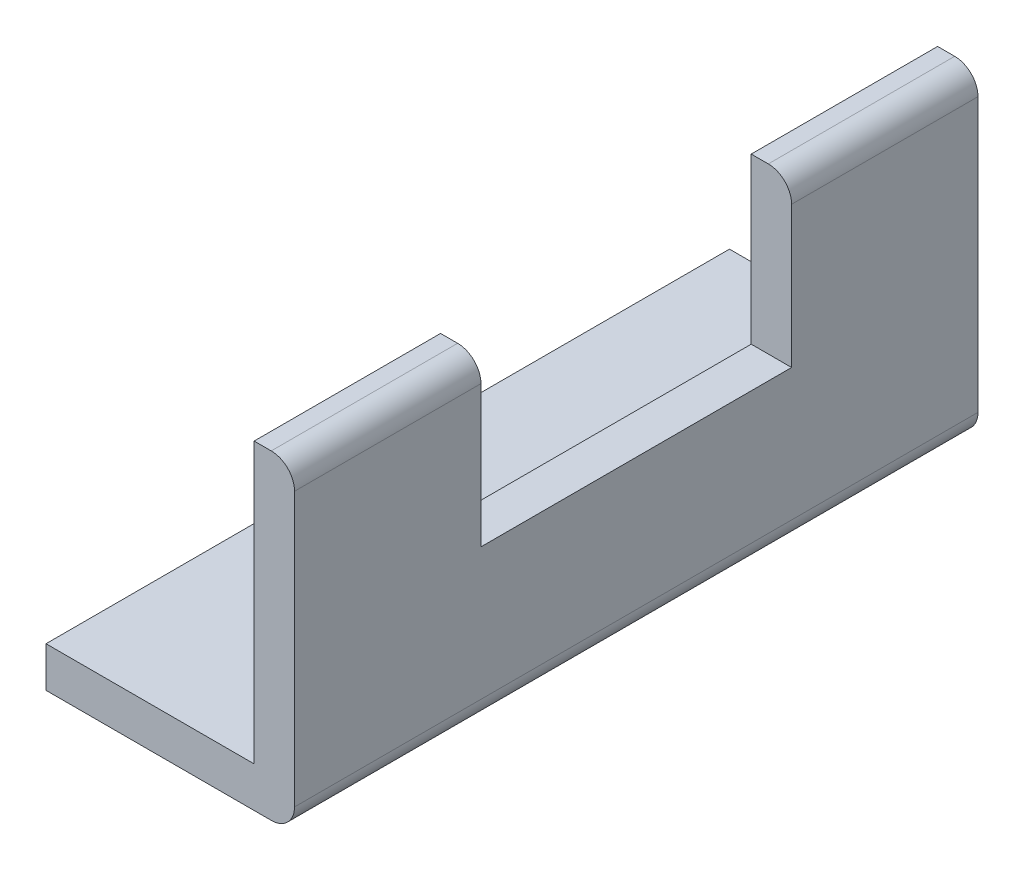
ISO-10303-21;
HEADER;
FILE_DESCRIPTION(('STEP AP214'),'2;1');
FILE_NAME('part.step','',(''),(''),'','','');
FILE_SCHEMA(('AUTOMOTIVE_DESIGN { 1 0 10303 214 1 1 1 1 }'));
ENDSEC;
DATA;
#1=APPLICATION_CONTEXT('core data for automotive mechanical design processes');
#2=APPLICATION_PROTOCOL_DEFINITION('international standard','automotive_design',2000,#1);
#3=PRODUCT_CONTEXT('',#1,'mechanical');
#4=PRODUCT('Part','Part','',(#3));
#5=PRODUCT_RELATED_PRODUCT_CATEGORY('part','',(#4));
#6=PRODUCT_DEFINITION_FORMATION('','',#4);
#7=PRODUCT_DEFINITION_CONTEXT('part definition',#1,'design');
#8=PRODUCT_DEFINITION('design','',#6,#7);
#9=PRODUCT_DEFINITION_SHAPE('','',#8);
#10=(LENGTH_UNIT() NAMED_UNIT(*) SI_UNIT(.MILLI.,.METRE.));
#11=(NAMED_UNIT(*) PLANE_ANGLE_UNIT() SI_UNIT($,.RADIAN.));
#12=(NAMED_UNIT(*) SI_UNIT($,.STERADIAN.) SOLID_ANGLE_UNIT());
#13=UNCERTAINTY_MEASURE_WITH_UNIT(LENGTH_MEASURE(1.E-05),#10,'distance_accuracy_value','');
#14=(GEOMETRIC_REPRESENTATION_CONTEXT(3) GLOBAL_UNCERTAINTY_ASSIGNED_CONTEXT((#13)) GLOBAL_UNIT_ASSIGNED_CONTEXT((#10,
#11,#12)) REPRESENTATION_CONTEXT('',''));
#15=CARTESIAN_POINT('',(0.,0.,0.));
#16=DIRECTION('',(0.,0.,1.));
#17=DIRECTION('',(1.,0.,0.));
#18=AXIS2_PLACEMENT_3D('',#15,#16,#17);
#19=CARTESIAN_POINT('',(0.,1.03,-1.6));
#20=DIRECTION('',(0.,0.,1.));
#21=DIRECTION('',(1.,0.,0.));
#22=AXIS2_PLACEMENT_3D('',#19,#20,#21);
#23=PLANE('',#22);
#24=DIRECTION('',(0.,1.,0.));
#25=VECTOR('',#24,1.);
#26=CARTESIAN_POINT('',(0.67,1.03,-1.6));
#27=LINE('',#26,#25);
#28=CARTESIAN_POINT('',(0.67,1.03,-1.6));
#29=VERTEX_POINT('',#28);
#30=CARTESIAN_POINT('',(0.67,0.5,-1.6));
#31=VERTEX_POINT('',#30);
#32=EDGE_CURVE('E145',#29,#31,#27,.F.);
#33=ORIENTED_EDGE('',*,*,#32,.T.);
#34=DIRECTION('',(1.,0.,0.));
#35=VECTOR('',#34,1.);
#36=CARTESIAN_POINT('',(0.,0.5,-1.6));
#37=LINE('',#36,#35);
#38=CARTESIAN_POINT('',(0.8,0.500000000000001,-1.6));
#39=VERTEX_POINT('',#38);
#40=EDGE_CURVE('E175',#31,#39,#37,.T.);
#41=ORIENTED_EDGE('',*,*,#40,.T.);
#42=DIRECTION('',(0.,1.,0.));
#43=VECTOR('',#42,1.);
#44=CARTESIAN_POINT('',(0.8,0.,-1.6));
#45=LINE('',#44,#43);
#46=CARTESIAN_POINT('',(0.8,0.955,-1.6));
#47=VERTEX_POINT('',#46);
#48=EDGE_CURVE('E125',#47,#39,#45,.F.);
#49=ORIENTED_EDGE('',*,*,#48,.F.);
#50=CARTESIAN_POINT('',(0.725,0.955,-1.6));
#51=DIRECTION('',(0.,0.,1.));
#52=DIRECTION('',(1.,0.,0.));
#53=AXIS2_PLACEMENT_3D('',#50,#51,#52);
#54=CIRCLE('',#53,0.075);
#55=CARTESIAN_POINT('',(0.725,1.03,-1.6));
#56=VERTEX_POINT('',#55);
#57=EDGE_CURVE('E20',#56,#47,#54,.F.);
#58=ORIENTED_EDGE('',*,*,#57,.F.);
#59=DIRECTION('',(-1.,0.,0.));
#60=VECTOR('',#59,1.);
#61=CARTESIAN_POINT('',(0.,1.03,-1.6));
#62=LINE('',#61,#60);
#63=EDGE_CURVE('E109',#29,#56,#62,.F.);
#64=ORIENTED_EDGE('',*,*,#63,.F.);
#65=EDGE_LOOP('',(#33,#41,#49,#58,#64));
#66=FACE_BOUND('',#65,.T.);
#67=ADVANCED_FACE('F17',(#66),#23,.T.);
#68=CARTESIAN_POINT('',(0.,0.5,-0.6));
#69=DIRECTION('',(0.,-1.,0.));
#70=DIRECTION('',(1.,0.,0.));
#71=AXIS2_PLACEMENT_3D('',#68,#69,#70);
#72=PLANE('',#71);
#73=DIRECTION('',(0.,0.,-1.));
#74=VECTOR('',#73,1.);
#75=CARTESIAN_POINT('',(0.8,0.5,-2.2));
#76=LINE('',#75,#74);
#77=CARTESIAN_POINT('',(0.8,0.5,-0.6));
#78=VERTEX_POINT('',#77);
#79=EDGE_CURVE('E161',#39,#78,#76,.F.);
#80=ORIENTED_EDGE('',*,*,#79,.F.);
#81=ORIENTED_EDGE('',*,*,#40,.F.);
#82=DIRECTION('',(0.,0.,1.));
#83=VECTOR('',#82,1.);
#84=CARTESIAN_POINT('',(0.67,0.5,-2.2));
#85=LINE('',#84,#83);
#86=CARTESIAN_POINT('',(0.67,0.5,-0.6));
#87=VERTEX_POINT('',#86);
#88=EDGE_CURVE('E165',#31,#87,#85,.T.);
#89=ORIENTED_EDGE('',*,*,#88,.T.);
#90=DIRECTION('',(1.,0.,0.));
#91=VECTOR('',#90,1.);
#92=CARTESIAN_POINT('',(0.,0.5,-0.6));
#93=LINE('',#92,#91);
#94=EDGE_CURVE('E150',#87,#78,#93,.T.);
#95=ORIENTED_EDGE('',*,*,#94,.T.);
#96=EDGE_LOOP('',(#80,#81,#89,#95));
#97=FACE_BOUND('',#96,.T.);
#98=ADVANCED_FACE('F295',(#97),#72,.F.);
#99=CARTESIAN_POINT('',(0.,1.03,-0.6));
#100=DIRECTION('',(0.,0.,1.));
#101=DIRECTION('',(0.,-1.,0.));
#102=AXIS2_PLACEMENT_3D('',#99,#100,#101);
#103=PLANE('',#102);
#104=CARTESIAN_POINT('',(0.725,0.955,-0.6));
#105=DIRECTION('',(0.,0.,1.));
#106=DIRECTION('',(1.,0.,0.));
#107=AXIS2_PLACEMENT_3D('',#104,#105,#106);
#108=CIRCLE('',#107,0.075);
#109=CARTESIAN_POINT('',(0.8,0.955,-0.6));
#110=VERTEX_POINT('',#109);
#111=CARTESIAN_POINT('',(0.725,1.03,-0.6));
#112=VERTEX_POINT('',#111);
#113=EDGE_CURVE('E203',#110,#112,#108,.T.);
#114=ORIENTED_EDGE('',*,*,#113,.F.);
#115=DIRECTION('',(0.,1.,0.));
#116=VECTOR('',#115,1.);
#117=CARTESIAN_POINT('',(0.8,0.,-0.6));
#118=LINE('',#117,#116);
#119=EDGE_CURVE('E128',#78,#110,#118,.T.);
#120=ORIENTED_EDGE('',*,*,#119,.F.);
#121=ORIENTED_EDGE('',*,*,#94,.F.);
#122=DIRECTION('',(0.,1.,0.));
#123=VECTOR('',#122,1.);
#124=CARTESIAN_POINT('',(0.67,1.03,-0.6));
#125=LINE('',#124,#123);
#126=CARTESIAN_POINT('',(0.67,1.03,-0.6));
#127=VERTEX_POINT('',#126);
#128=EDGE_CURVE('E120',#87,#127,#125,.T.);
#129=ORIENTED_EDGE('',*,*,#128,.T.);
#130=DIRECTION('',(-1.,0.,0.));
#131=VECTOR('',#130,1.);
#132=CARTESIAN_POINT('',(0.,1.03,-0.6));
#133=LINE('',#132,#131);
#134=EDGE_CURVE('E157',#112,#127,#133,.T.);
#135=ORIENTED_EDGE('',*,*,#134,.F.);
#136=EDGE_LOOP('',(#114,#120,#121,#129,#135));
#137=FACE_BOUND('',#136,.T.);
#138=ADVANCED_FACE('F298',(#137),#103,.F.);
#139=CARTESIAN_POINT('',(0.67,1.03,-2.2));
#140=DIRECTION('',(1.,0.,0.));
#141=DIRECTION('',(0.,1.,0.));
#142=AXIS2_PLACEMENT_3D('',#139,#140,#141);
#143=PLANE('',#142);
#144=ORIENTED_EDGE('',*,*,#128,.F.);
#145=ORIENTED_EDGE('',*,*,#88,.F.);
#146=ORIENTED_EDGE('',*,*,#32,.F.);
#147=DIRECTION('',(0.,0.,1.));
#148=VECTOR('',#147,1.);
#149=CARTESIAN_POINT('',(0.67,1.03,-2.2));
#150=LINE('',#149,#148);
#151=CARTESIAN_POINT('',(0.67,1.03,-2.2));
#152=VERTEX_POINT('',#151);
#153=EDGE_CURVE('E117',#152,#29,#150,.T.);
#154=ORIENTED_EDGE('',*,*,#153,.F.);
#155=DIRECTION('',(0.,1.,0.));
#156=VECTOR('',#155,1.);
#157=CARTESIAN_POINT('',(0.67,1.03,-2.2));
#158=LINE('',#157,#156);
#159=CARTESIAN_POINT('',(0.67,0.13,-2.2));
#160=VERTEX_POINT('',#159);
#161=EDGE_CURVE('E143',#160,#152,#158,.T.);
#162=ORIENTED_EDGE('',*,*,#161,.F.);
#163=DIRECTION('',(0.,0.,1.));
#164=VECTOR('',#163,1.);
#165=CARTESIAN_POINT('',(0.67,0.13,-2.2));
#166=LINE('',#165,#164);
#167=CARTESIAN_POINT('',(0.67,0.13,0.));
#168=VERTEX_POINT('',#167);
#169=EDGE_CURVE('E220',#160,#168,#166,.T.);
#170=ORIENTED_EDGE('',*,*,#169,.T.);
#171=DIRECTION('',(0.,1.,0.));
#172=VECTOR('',#171,1.);
#173=CARTESIAN_POINT('',(0.67,1.03,0.));
#174=LINE('',#173,#172);
#175=CARTESIAN_POINT('',(0.67,1.03,0.));
#176=VERTEX_POINT('',#175);
#177=EDGE_CURVE('E146',#176,#168,#174,.F.);
#178=ORIENTED_EDGE('',*,*,#177,.F.);
#179=DIRECTION('',(0.,0.,1.));
#180=VECTOR('',#179,1.);
#181=CARTESIAN_POINT('',(0.67,1.03,-2.2));
#182=LINE('',#181,#180);
#183=EDGE_CURVE('E160',#127,#176,#182,.T.);
#184=ORIENTED_EDGE('',*,*,#183,.F.);
#185=EDGE_LOOP('',(#144,#145,#146,#154,#162,#170,#178,#184));
#186=FACE_BOUND('',#185,.T.);
#187=ADVANCED_FACE('F288',(#186),#143,.F.);
#188=CARTESIAN_POINT('',(0.,1.03,-2.2));
#189=DIRECTION('',(0.,1.,0.));
#190=DIRECTION('',(-1.,0.,0.));
#191=AXIS2_PLACEMENT_3D('',#188,#189,#190);
#192=PLANE('',#191);
#193=DIRECTION('',(-1.,0.,0.));
#194=VECTOR('',#193,1.);
#195=CARTESIAN_POINT('',(0.,1.03,-2.2));
#196=LINE('',#195,#194);
#197=CARTESIAN_POINT('',(0.725,1.03,-2.2));
#198=VERTEX_POINT('',#197);
#199=EDGE_CURVE('E202',#152,#198,#196,.F.);
#200=ORIENTED_EDGE('',*,*,#199,.F.);
#201=ORIENTED_EDGE('',*,*,#153,.T.);
#202=ORIENTED_EDGE('',*,*,#63,.T.);
#203=DIRECTION('',(0.,0.,1.));
#204=VECTOR('',#203,1.);
#205=CARTESIAN_POINT('',(0.725,1.03,-2.2));
#206=LINE('',#205,#204);
#207=EDGE_CURVE('E114',#198,#56,#206,.T.);
#208=ORIENTED_EDGE('',*,*,#207,.F.);
#209=EDGE_LOOP('',(#200,#201,#202,#208));
#210=FACE_BOUND('',#209,.T.);
#211=ADVANCED_FACE('F112',(#210),#192,.T.);
#212=CARTESIAN_POINT('',(0.725,0.955,-2.2));
#213=DIRECTION('',(0.,0.,1.));
#214=DIRECTION('',(1.,0.,0.));
#215=AXIS2_PLACEMENT_3D('',#212,#213,#214);
#216=CYLINDRICAL_SURFACE('',#215,0.075);
#217=ORIENTED_EDGE('',*,*,#57,.T.);
#218=DIRECTION('',(0.,0.,-1.));
#219=VECTOR('',#218,1.);
#220=CARTESIAN_POINT('',(0.8,0.955,-2.2));
#221=LINE('',#220,#219);
#222=CARTESIAN_POINT('',(0.8,0.955,-2.2));
#223=VERTEX_POINT('',#222);
#224=EDGE_CURVE('E141',#223,#47,#221,.F.);
#225=ORIENTED_EDGE('',*,*,#224,.F.);
#226=CARTESIAN_POINT('',(0.725,0.955,-2.2));
#227=DIRECTION('',(0.,0.,1.));
#228=DIRECTION('',(1.,0.,0.));
#229=AXIS2_PLACEMENT_3D('',#226,#227,#228);
#230=CIRCLE('',#229,0.075);
#231=EDGE_CURVE('E131',#198,#223,#230,.F.);
#232=ORIENTED_EDGE('',*,*,#231,.F.);
#233=ORIENTED_EDGE('',*,*,#207,.T.);
#234=EDGE_LOOP('',(#217,#225,#232,#233));
#235=FACE_BOUND('',#234,.T.);
#236=ADVANCED_FACE('F129',(#235),#216,.T.);
#237=CARTESIAN_POINT('',(0.8,0.,-2.2));
#238=DIRECTION('',(1.,0.,0.));
#239=DIRECTION('',(0.,0.,-1.));
#240=AXIS2_PLACEMENT_3D('',#237,#238,#239);
#241=PLANE('',#240);
#242=ORIENTED_EDGE('',*,*,#48,.T.);
#243=ORIENTED_EDGE('',*,*,#79,.T.);
#244=ORIENTED_EDGE('',*,*,#119,.T.);
#245=DIRECTION('',(0.,0.,1.));
#246=VECTOR('',#245,1.);
#247=CARTESIAN_POINT('',(0.8,0.955,-2.2));
#248=LINE('',#247,#246);
#249=CARTESIAN_POINT('',(0.8,0.955,0.));
#250=VERTEX_POINT('',#249);
#251=EDGE_CURVE('E209',#250,#110,#248,.F.);
#252=ORIENTED_EDGE('',*,*,#251,.F.);
#253=DIRECTION('',(0.,1.,0.));
#254=VECTOR('',#253,1.);
#255=CARTESIAN_POINT('',(0.8,0.,0.));
#256=LINE('',#255,#254);
#257=CARTESIAN_POINT('',(0.8,0.075,0.));
#258=VERTEX_POINT('',#257);
#259=EDGE_CURVE('E136',#250,#258,#256,.F.);
#260=ORIENTED_EDGE('',*,*,#259,.T.);
#261=DIRECTION('',(0.,0.,1.));
#262=VECTOR('',#261,1.);
#263=CARTESIAN_POINT('',(0.8,0.075,-2.2));
#264=LINE('',#263,#262);
#265=CARTESIAN_POINT('',(0.8,0.075,-2.2));
#266=VERTEX_POINT('',#265);
#267=EDGE_CURVE('E198',#266,#258,#264,.T.);
#268=ORIENTED_EDGE('',*,*,#267,.F.);
#269=DIRECTION('',(0.,1.,0.));
#270=VECTOR('',#269,1.);
#271=CARTESIAN_POINT('',(0.8,0.,-2.2));
#272=LINE('',#271,#270);
#273=EDGE_CURVE('E223',#223,#266,#272,.F.);
#274=ORIENTED_EDGE('',*,*,#273,.F.);
#275=ORIENTED_EDGE('',*,*,#224,.T.);
#276=EDGE_LOOP('',(#242,#243,#244,#252,#260,#268,#274,#275));
#277=FACE_BOUND('',#276,.T.);
#278=ADVANCED_FACE('F290',(#277),#241,.T.);
#279=CARTESIAN_POINT('',(0.,1.03,-2.2));
#280=DIRECTION('',(0.,1.,0.));
#281=DIRECTION('',(-1.,0.,0.));
#282=AXIS2_PLACEMENT_3D('',#279,#280,#281);
#283=PLANE('',#282);
#284=ORIENTED_EDGE('',*,*,#134,.T.);
#285=ORIENTED_EDGE('',*,*,#183,.T.);
#286=DIRECTION('',(-1.,0.,0.));
#287=VECTOR('',#286,1.);
#288=CARTESIAN_POINT('',(0.,1.03,0.));
#289=LINE('',#288,#287);
#290=CARTESIAN_POINT('',(0.725,1.03,0.));
#291=VERTEX_POINT('',#290);
#292=EDGE_CURVE('E194',#176,#291,#289,.F.);
#293=ORIENTED_EDGE('',*,*,#292,.T.);
#294=DIRECTION('',(0.,0.,1.));
#295=VECTOR('',#294,1.);
#296=CARTESIAN_POINT('',(0.725,1.03,-2.2));
#297=LINE('',#296,#295);
#298=EDGE_CURVE('E205',#112,#291,#297,.T.);
#299=ORIENTED_EDGE('',*,*,#298,.F.);
#300=EDGE_LOOP('',(#284,#285,#293,#299));
#301=FACE_BOUND('',#300,.T.);
#302=ADVANCED_FACE('F300',(#301),#283,.T.);
#303=CARTESIAN_POINT('',(0.725,0.955,-2.2));
#304=DIRECTION('',(0.,0.,1.));
#305=DIRECTION('',(1.,0.,0.));
#306=AXIS2_PLACEMENT_3D('',#303,#304,#305);
#307=CYLINDRICAL_SURFACE('',#306,0.075);
#308=CARTESIAN_POINT('',(0.725,0.955,0.));
#309=DIRECTION('',(0.,0.,1.));
#310=DIRECTION('',(1.,0.,0.));
#311=AXIS2_PLACEMENT_3D('',#308,#309,#310);
#312=CIRCLE('',#311,0.075);
#313=EDGE_CURVE('E190',#291,#250,#312,.F.);
#314=ORIENTED_EDGE('',*,*,#313,.T.);
#315=ORIENTED_EDGE('',*,*,#251,.T.);
#316=ORIENTED_EDGE('',*,*,#113,.T.);
#317=ORIENTED_EDGE('',*,*,#298,.T.);
#318=EDGE_LOOP('',(#314,#315,#316,#317));
#319=FACE_BOUND('',#318,.T.);
#320=ADVANCED_FACE('F301',(#319),#307,.T.);
#321=CARTESIAN_POINT('',(0.67,0.13,-2.2));
#322=DIRECTION('',(0.,-1.,0.));
#323=DIRECTION('',(1.,0.,0.));
#324=AXIS2_PLACEMENT_3D('',#321,#322,#323);
#325=PLANE('',#324);
#326=ORIENTED_EDGE('',*,*,#169,.F.);
#327=DIRECTION('',(-1.,0.,0.));
#328=VECTOR('',#327,1.);
#329=CARTESIAN_POINT('',(0.,0.13,-2.2));
#330=LINE('',#329,#328);
#331=CARTESIAN_POINT('',(0.,0.13,-2.2));
#332=VERTEX_POINT('',#331);
#333=EDGE_CURVE('E261',#332,#160,#330,.F.);
#334=ORIENTED_EDGE('',*,*,#333,.F.);
#335=DIRECTION('',(0.,0.,1.));
#336=VECTOR('',#335,1.);
#337=CARTESIAN_POINT('',(0.,0.13,-2.2));
#338=LINE('',#337,#336);
#339=CARTESIAN_POINT('',(0.,0.13,0.));
#340=VERTEX_POINT('',#339);
#341=EDGE_CURVE('E193',#340,#332,#338,.F.);
#342=ORIENTED_EDGE('',*,*,#341,.F.);
#343=DIRECTION('',(-1.,0.,0.));
#344=VECTOR('',#343,1.);
#345=CARTESIAN_POINT('',(0.,0.13,0.));
#346=LINE('',#345,#344);
#347=EDGE_CURVE('E197',#340,#168,#346,.F.);
#348=ORIENTED_EDGE('',*,*,#347,.T.);
#349=EDGE_LOOP('',(#326,#334,#342,#348));
#350=FACE_BOUND('',#349,.T.);
#351=ADVANCED_FACE('F285',(#350),#325,.F.);
#352=CARTESIAN_POINT('',(0.,0.,-2.2));
#353=DIRECTION('',(0.,0.,-1.));
#354=DIRECTION('',(-1.,0.,0.));
#355=AXIS2_PLACEMENT_3D('',#352,#353,#354);
#356=PLANE('',#355);
#357=ORIENTED_EDGE('',*,*,#199,.T.);
#358=ORIENTED_EDGE('',*,*,#231,.T.);
#359=ORIENTED_EDGE('',*,*,#273,.T.);
#360=CARTESIAN_POINT('',(0.725,0.075,-2.2));
#361=DIRECTION('',(0.,0.,1.));
#362=DIRECTION('',(1.,0.,0.));
#363=AXIS2_PLACEMENT_3D('',#360,#361,#362);
#364=CIRCLE('',#363,0.075);
#365=CARTESIAN_POINT('',(0.725,0.,-2.2));
#366=VERTEX_POINT('',#365);
#367=EDGE_CURVE('E199',#366,#266,#364,.T.);
#368=ORIENTED_EDGE('',*,*,#367,.F.);
#369=DIRECTION('',(1.,0.,0.));
#370=VECTOR('',#369,1.);
#371=CARTESIAN_POINT('',(0.,0.,-2.2));
#372=LINE('',#371,#370);
#373=CARTESIAN_POINT('',(0.,0.,-2.2));
#374=VERTEX_POINT('',#373);
#375=EDGE_CURVE('E243',#374,#366,#372,.T.);
#376=ORIENTED_EDGE('',*,*,#375,.F.);
#377=DIRECTION('',(0.,1.,0.));
#378=VECTOR('',#377,1.);
#379=CARTESIAN_POINT('',(0.,0.,-2.2));
#380=LINE('',#379,#378);
#381=EDGE_CURVE('E255',#332,#374,#380,.F.);
#382=ORIENTED_EDGE('',*,*,#381,.F.);
#383=ORIENTED_EDGE('',*,*,#333,.T.);
#384=ORIENTED_EDGE('',*,*,#161,.T.);
#385=EDGE_LOOP('',(#357,#358,#359,#368,#376,#382,#383,#384));
#386=FACE_BOUND('',#385,.T.);
#387=ADVANCED_FACE('F282',(#386),#356,.T.);
#388=CARTESIAN_POINT('',(0.725,0.075,-2.2));
#389=DIRECTION('',(0.,0.,1.));
#390=DIRECTION('',(1.,0.,0.));
#391=AXIS2_PLACEMENT_3D('',#388,#389,#390);
#392=CYLINDRICAL_SURFACE('',#391,0.075);
#393=CARTESIAN_POINT('',(0.725,0.075,0.));
#394=DIRECTION('',(0.,0.,1.));
#395=DIRECTION('',(1.,0.,0.));
#396=AXIS2_PLACEMENT_3D('',#393,#394,#395);
#397=CIRCLE('',#396,0.075);
#398=CARTESIAN_POINT('',(0.725,0.,0.));
#399=VERTEX_POINT('',#398);
#400=EDGE_CURVE('E195',#258,#399,#397,.F.);
#401=ORIENTED_EDGE('',*,*,#400,.T.);
#402=DIRECTION('',(0.,0.,-1.));
#403=VECTOR('',#402,1.);
#404=CARTESIAN_POINT('',(0.725,0.,-2.2));
#405=LINE('',#404,#403);
#406=EDGE_CURVE('E239',#366,#399,#405,.F.);
#407=ORIENTED_EDGE('',*,*,#406,.F.);
#408=ORIENTED_EDGE('',*,*,#367,.T.);
#409=ORIENTED_EDGE('',*,*,#267,.T.);
#410=EDGE_LOOP('',(#401,#407,#408,#409));
#411=FACE_BOUND('',#410,.T.);
#412=ADVANCED_FACE('F229',(#411),#392,.T.);
#413=CARTESIAN_POINT('',(0.,0.,0.));
#414=DIRECTION('',(0.,0.,-1.));
#415=DIRECTION('',(-1.,0.,0.));
#416=AXIS2_PLACEMENT_3D('',#413,#414,#415);
#417=PLANE('',#416);
#418=ORIENTED_EDGE('',*,*,#313,.F.);
#419=ORIENTED_EDGE('',*,*,#292,.F.);
#420=ORIENTED_EDGE('',*,*,#177,.T.);
#421=ORIENTED_EDGE('',*,*,#347,.F.);
#422=DIRECTION('',(0.,1.,0.));
#423=VECTOR('',#422,1.);
#424=CARTESIAN_POINT('',(0.,0.,0.));
#425=LINE('',#424,#423);
#426=CARTESIAN_POINT('',(0.,0.,0.));
#427=VERTEX_POINT('',#426);
#428=EDGE_CURVE('E35',#427,#340,#425,.T.);
#429=ORIENTED_EDGE('',*,*,#428,.F.);
#430=DIRECTION('',(1.,0.,0.));
#431=VECTOR('',#430,1.);
#432=CARTESIAN_POINT('',(0.,0.,0.));
#433=LINE('',#432,#431);
#434=EDGE_CURVE('E26',#399,#427,#433,.F.);
#435=ORIENTED_EDGE('',*,*,#434,.F.);
#436=ORIENTED_EDGE('',*,*,#400,.F.);
#437=ORIENTED_EDGE('',*,*,#259,.F.);
#438=EDGE_LOOP('',(#418,#419,#420,#421,#429,#435,#436,#437));
#439=FACE_BOUND('',#438,.T.);
#440=ADVANCED_FACE('F234',(#439),#417,.F.);
#441=CARTESIAN_POINT('',(0.,0.,-2.2));
#442=DIRECTION('',(-1.,0.,0.));
#443=DIRECTION('',(0.,0.,1.));
#444=AXIS2_PLACEMENT_3D('',#441,#442,#443);
#445=PLANE('',#444);
#446=DIRECTION('',(0.,0.,-1.));
#447=VECTOR('',#446,1.);
#448=CARTESIAN_POINT('',(0.,0.,-2.2));
#449=LINE('',#448,#447);
#450=EDGE_CURVE('E11',#427,#374,#449,.T.);
#451=ORIENTED_EDGE('',*,*,#450,.F.);
#452=ORIENTED_EDGE('',*,*,#428,.T.);
#453=ORIENTED_EDGE('',*,*,#341,.T.);
#454=ORIENTED_EDGE('',*,*,#381,.T.);
#455=EDGE_LOOP('',(#451,#452,#453,#454));
#456=FACE_BOUND('',#455,.T.);
#457=ADVANCED_FACE('F303',(#456),#445,.T.);
#458=CARTESIAN_POINT('',(0.,0.,-2.2));
#459=DIRECTION('',(0.,-1.,0.));
#460=DIRECTION('',(0.,0.,-1.));
#461=AXIS2_PLACEMENT_3D('',#458,#459,#460);
#462=PLANE('',#461);
#463=ORIENTED_EDGE('',*,*,#434,.T.);
#464=ORIENTED_EDGE('',*,*,#450,.T.);
#465=ORIENTED_EDGE('',*,*,#375,.T.);
#466=ORIENTED_EDGE('',*,*,#406,.T.);
#467=EDGE_LOOP('',(#463,#464,#465,#466));
#468=FACE_BOUND('',#467,.T.);
#469=ADVANCED_FACE('F242',(#468),#462,.T.);
#470=CLOSED_SHELL('',(#67,#98,#138,#187,#211,#236,#278,#302,#320,#351,#387,#412,#440,#457,#469));
#471=MANIFOLD_SOLID_BREP('B1',#470);
#472=ADVANCED_BREP_SHAPE_REPRESENTATION('',(#18,#471),#14);
#473=SHAPE_DEFINITION_REPRESENTATION(#9,#472);
ENDSEC;
END-ISO-10303-21;
